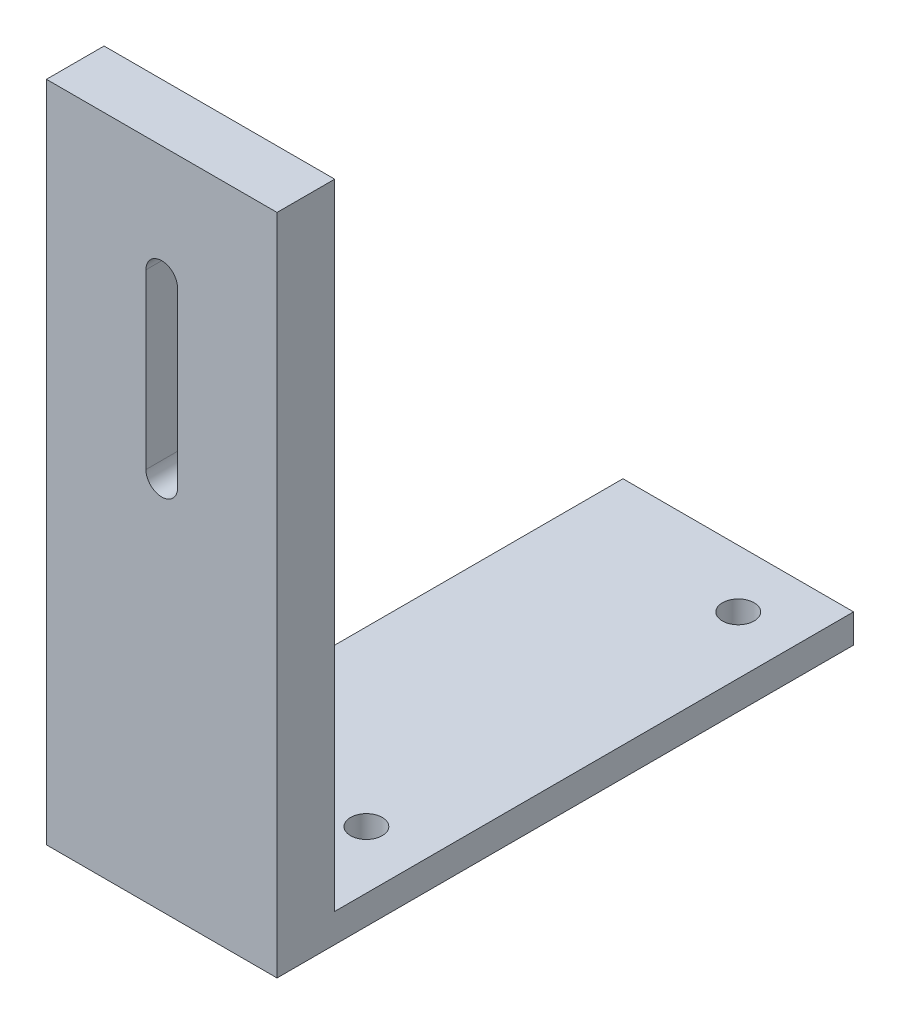
ISO-10303-21;
HEADER;
FILE_DESCRIPTION(('STEP AP214'),'2;1');
FILE_NAME('part.step','',(''),(''),'','','');
FILE_SCHEMA(('AUTOMOTIVE_DESIGN { 1 0 10303 214 1 1 1 1 }'));
ENDSEC;
DATA;
#1=APPLICATION_CONTEXT('core data for automotive mechanical design processes');
#2=APPLICATION_PROTOCOL_DEFINITION('international standard','automotive_design',2000,#1);
#3=PRODUCT_CONTEXT('',#1,'mechanical');
#4=PRODUCT('Part','Part','',(#3));
#5=PRODUCT_RELATED_PRODUCT_CATEGORY('part','',(#4));
#6=PRODUCT_DEFINITION_FORMATION('','',#4);
#7=PRODUCT_DEFINITION_CONTEXT('part definition',#1,'design');
#8=PRODUCT_DEFINITION('design','',#6,#7);
#9=PRODUCT_DEFINITION_SHAPE('','',#8);
#10=(LENGTH_UNIT() NAMED_UNIT(*) SI_UNIT(.MILLI.,.METRE.));
#11=(NAMED_UNIT(*) PLANE_ANGLE_UNIT() SI_UNIT($,.RADIAN.));
#12=(NAMED_UNIT(*) SI_UNIT($,.STERADIAN.) SOLID_ANGLE_UNIT());
#13=UNCERTAINTY_MEASURE_WITH_UNIT(LENGTH_MEASURE(1.E-05),#10,'distance_accuracy_value','');
#14=(GEOMETRIC_REPRESENTATION_CONTEXT(3) GLOBAL_UNCERTAINTY_ASSIGNED_CONTEXT((#13)) GLOBAL_UNIT_ASSIGNED_CONTEXT((#10,
#11,#12)) REPRESENTATION_CONTEXT('',''));
#15=CARTESIAN_POINT('',(0.,0.,0.));
#16=DIRECTION('',(0.,0.,1.));
#17=DIRECTION('',(1.,0.,0.));
#18=AXIS2_PLACEMENT_3D('',#15,#16,#17);
#19=CARTESIAN_POINT('',(-23.057052804601,5.,100.));
#20=DIRECTION('',(0.,-1.,0.));
#21=DIRECTION('',(0.,0.,-1.));
#22=AXIS2_PLACEMENT_3D('',#19,#20,#21);
#23=PLANE('',#22);
#24=CARTESIAN_POINT('',(6.94294719539896,5.,9.99999999999999));
#25=DIRECTION('',(0.,1.,0.));
#26=DIRECTION('',(0.,0.,1.));
#27=AXIS2_PLACEMENT_3D('',#24,#25,#26);
#28=CIRCLE('',#27,2.75);
#29=CARTESIAN_POINT('',(6.94294719539896,5.,12.75));
#30=VERTEX_POINT('',#29);
#31=EDGE_CURVE('E181',#30,#30,#28,.T.);
#32=ORIENTED_EDGE('',*,*,#31,.F.);
#33=EDGE_LOOP('',(#32));
#34=FACE_BOUND('',#33,.T.);
#35=CARTESIAN_POINT('',(6.94294719539897,5.,74.5));
#36=DIRECTION('',(0.,1.,0.));
#37=DIRECTION('',(0.,0.,1.));
#38=AXIS2_PLACEMENT_3D('',#35,#36,#37);
#39=CIRCLE('',#38,2.75);
#40=CARTESIAN_POINT('',(6.94294719539897,5.,77.25));
#41=VERTEX_POINT('',#40);
#42=EDGE_CURVE('E173',#41,#41,#39,.T.);
#43=ORIENTED_EDGE('',*,*,#42,.F.);
#44=EDGE_LOOP('',(#43));
#45=FACE_BOUND('',#44,.T.);
#46=DIRECTION('',(-1.,0.,0.));
#47=VECTOR('',#46,1.);
#48=CARTESIAN_POINT('',(-23.057052804601,5.,90.));
#49=LINE('',#48,#47);
#50=CARTESIAN_POINT('',(16.942947195399,5.,90.));
#51=VERTEX_POINT('',#50);
#52=CARTESIAN_POINT('',(-23.057052804601,5.,90.));
#53=VERTEX_POINT('',#52);
#54=EDGE_CURVE('E144',#51,#53,#49,.T.);
#55=ORIENTED_EDGE('',*,*,#54,.F.);
#56=DIRECTION('',(0.,0.,-1.));
#57=VECTOR('',#56,1.);
#58=CARTESIAN_POINT('',(16.942947195399,5.,100.));
#59=LINE('',#58,#57);
#60=CARTESIAN_POINT('',(16.942947195399,5.,0.));
#61=VERTEX_POINT('',#60);
#62=EDGE_CURVE('E11',#51,#61,#59,.T.);
#63=ORIENTED_EDGE('',*,*,#62,.T.);
#64=DIRECTION('',(-1.,0.,0.));
#65=VECTOR('',#64,1.);
#66=CARTESIAN_POINT('',(-23.057052804601,5.,0.));
#67=LINE('',#66,#65);
#68=CARTESIAN_POINT('',(-23.057052804601,5.,0.));
#69=VERTEX_POINT('',#68);
#70=EDGE_CURVE('E199',#61,#69,#67,.T.);
#71=ORIENTED_EDGE('',*,*,#70,.T.);
#72=DIRECTION('',(0.,0.,-1.));
#73=VECTOR('',#72,1.);
#74=CARTESIAN_POINT('',(-23.057052804601,5.,100.));
#75=LINE('',#74,#73);
#76=EDGE_CURVE('E42',#53,#69,#75,.T.);
#77=ORIENTED_EDGE('',*,*,#76,.F.);
#78=EDGE_LOOP('',(#55,#63,#71,#77));
#79=FACE_BOUND('',#78,.T.);
#80=ADVANCED_FACE('F33',(#34,#45,#79),#23,.F.);
#81=CARTESIAN_POINT('',(16.942947195399,5.,100.));
#82=DIRECTION('',(-1.,0.,0.));
#83=DIRECTION('',(0.,-1.,0.));
#84=AXIS2_PLACEMENT_3D('',#81,#82,#83);
#85=PLANE('',#84);
#86=DIRECTION('',(0.,1.,0.));
#87=VECTOR('',#86,1.);
#88=CARTESIAN_POINT('',(16.942947195399,5.,0.));
#89=LINE('',#88,#87);
#90=CARTESIAN_POINT('',(16.942947195399,0.,0.));
#91=VERTEX_POINT('',#90);
#92=EDGE_CURVE('E186',#91,#61,#89,.T.);
#93=ORIENTED_EDGE('',*,*,#92,.T.);
#94=ORIENTED_EDGE('',*,*,#62,.F.);
#95=DIRECTION('',(0.,-1.,0.));
#96=VECTOR('',#95,1.);
#97=CARTESIAN_POINT('',(16.942947195399,115.,90.));
#98=LINE('',#97,#96);
#99=CARTESIAN_POINT('',(16.942947195399,115.,90.));
#100=VERTEX_POINT('',#99);
#101=EDGE_CURVE('E170',#100,#51,#98,.T.);
#102=ORIENTED_EDGE('',*,*,#101,.F.);
#103=DIRECTION('',(0.,0.,-1.));
#104=VECTOR('',#103,1.);
#105=CARTESIAN_POINT('',(16.942947195399,115.,100.));
#106=LINE('',#105,#104);
#107=CARTESIAN_POINT('',(16.942947195399,115.,100.));
#108=VERTEX_POINT('',#107);
#109=EDGE_CURVE('E154',#108,#100,#106,.T.);
#110=ORIENTED_EDGE('',*,*,#109,.F.);
#111=DIRECTION('',(0.,1.,0.));
#112=VECTOR('',#111,1.);
#113=CARTESIAN_POINT('',(16.942947195399,5.,100.));
#114=LINE('',#113,#112);
#115=CARTESIAN_POINT('',(16.942947195399,0.,100.));
#116=VERTEX_POINT('',#115);
#117=EDGE_CURVE('E189',#116,#108,#114,.T.);
#118=ORIENTED_EDGE('',*,*,#117,.F.);
#119=DIRECTION('',(0.,0.,-1.));
#120=VECTOR('',#119,1.);
#121=CARTESIAN_POINT('',(16.942947195399,0.,100.));
#122=LINE('',#121,#120);
#123=EDGE_CURVE('E196',#116,#91,#122,.T.);
#124=ORIENTED_EDGE('',*,*,#123,.T.);
#125=EDGE_LOOP('',(#93,#94,#102,#110,#118,#124));
#126=FACE_BOUND('',#125,.T.);
#127=ADVANCED_FACE('F35',(#126),#85,.F.);
#128=CARTESIAN_POINT('',(-23.057052804601,5.,100.));
#129=DIRECTION('',(1.,0.,0.));
#130=DIRECTION('',(0.,0.,-1.));
#131=AXIS2_PLACEMENT_3D('',#128,#129,#130);
#132=PLANE('',#131);
#133=DIRECTION('',(0.,-1.,0.));
#134=VECTOR('',#133,1.);
#135=CARTESIAN_POINT('',(-23.057052804601,5.,0.));
#136=LINE('',#135,#134);
#137=CARTESIAN_POINT('',(-23.057052804601,0.,0.));
#138=VERTEX_POINT('',#137);
#139=EDGE_CURVE('E202',#69,#138,#136,.T.);
#140=ORIENTED_EDGE('',*,*,#139,.T.);
#141=DIRECTION('',(0.,0.,-1.));
#142=VECTOR('',#141,1.);
#143=CARTESIAN_POINT('',(-23.057052804601,0.,100.));
#144=LINE('',#143,#142);
#145=CARTESIAN_POINT('',(-23.057052804601,0.,100.));
#146=VERTEX_POINT('',#145);
#147=EDGE_CURVE('E207',#146,#138,#144,.T.);
#148=ORIENTED_EDGE('',*,*,#147,.F.);
#149=DIRECTION('',(0.,-1.,0.));
#150=VECTOR('',#149,1.);
#151=CARTESIAN_POINT('',(-23.057052804601,5.,100.));
#152=LINE('',#151,#150);
#153=CARTESIAN_POINT('',(-23.057052804601,115.,100.));
#154=VERTEX_POINT('',#153);
#155=EDGE_CURVE('E191',#154,#146,#152,.T.);
#156=ORIENTED_EDGE('',*,*,#155,.F.);
#157=DIRECTION('',(0.,0.,1.));
#158=VECTOR('',#157,1.);
#159=CARTESIAN_POINT('',(-23.057052804601,115.,100.));
#160=LINE('',#159,#158);
#161=CARTESIAN_POINT('',(-23.057052804601,115.,90.));
#162=VERTEX_POINT('',#161);
#163=EDGE_CURVE('E148',#162,#154,#160,.T.);
#164=ORIENTED_EDGE('',*,*,#163,.F.);
#165=DIRECTION('',(0.,-1.,0.));
#166=VECTOR('',#165,1.);
#167=CARTESIAN_POINT('',(-23.057052804601,115.,90.));
#168=LINE('',#167,#166);
#169=EDGE_CURVE('E158',#162,#53,#168,.T.);
#170=ORIENTED_EDGE('',*,*,#169,.T.);
#171=ORIENTED_EDGE('',*,*,#76,.T.);
#172=EDGE_LOOP('',(#140,#148,#156,#164,#170,#171));
#173=FACE_BOUND('',#172,.T.);
#174=ADVANCED_FACE('F213',(#173),#132,.F.);
#175=CARTESIAN_POINT('',(-23.057052804601,0.,100.));
#176=DIRECTION('',(0.,1.,0.));
#177=DIRECTION('',(-1.,0.,0.));
#178=AXIS2_PLACEMENT_3D('',#175,#176,#177);
#179=PLANE('',#178);
#180=CARTESIAN_POINT('',(6.94294719539897,0.,74.5));
#181=DIRECTION('',(0.,1.,0.));
#182=DIRECTION('',(0.,0.,1.));
#183=AXIS2_PLACEMENT_3D('',#180,#181,#182);
#184=CIRCLE('',#183,2.75);
#185=CARTESIAN_POINT('',(6.94294719539897,0.,77.25));
#186=VERTEX_POINT('',#185);
#187=EDGE_CURVE('E161',#186,#186,#184,.T.);
#188=ORIENTED_EDGE('',*,*,#187,.T.);
#189=EDGE_LOOP('',(#188));
#190=FACE_BOUND('',#189,.T.);
#191=CARTESIAN_POINT('',(6.94294719539896,0.,9.99999999999999));
#192=DIRECTION('',(0.,1.,0.));
#193=DIRECTION('',(0.,0.,1.));
#194=AXIS2_PLACEMENT_3D('',#191,#192,#193);
#195=CIRCLE('',#194,2.75);
#196=CARTESIAN_POINT('',(6.94294719539896,0.,12.75));
#197=VERTEX_POINT('',#196);
#198=EDGE_CURVE('E183',#197,#197,#195,.T.);
#199=ORIENTED_EDGE('',*,*,#198,.T.);
#200=EDGE_LOOP('',(#199));
#201=FACE_BOUND('',#200,.T.);
#202=DIRECTION('',(1.,0.,0.));
#203=VECTOR('',#202,1.);
#204=CARTESIAN_POINT('',(-23.057052804601,0.,0.));
#205=LINE('',#204,#203);
#206=EDGE_CURVE('E192',#138,#91,#205,.T.);
#207=ORIENTED_EDGE('',*,*,#206,.T.);
#208=ORIENTED_EDGE('',*,*,#123,.F.);
#209=DIRECTION('',(1.,0.,0.));
#210=VECTOR('',#209,1.);
#211=CARTESIAN_POINT('',(-23.057052804601,0.,100.));
#212=LINE('',#211,#210);
#213=EDGE_CURVE('E194',#146,#116,#212,.T.);
#214=ORIENTED_EDGE('',*,*,#213,.F.);
#215=ORIENTED_EDGE('',*,*,#147,.T.);
#216=EDGE_LOOP('',(#207,#208,#214,#215));
#217=FACE_BOUND('',#216,.T.);
#218=ADVANCED_FACE('F227',(#190,#201,#217),#179,.F.);
#219=CARTESIAN_POINT('',(0.,0.,100.));
#220=DIRECTION('',(0.,0.,1.));
#221=DIRECTION('',(1.,0.,0.));
#222=AXIS2_PLACEMENT_3D('',#219,#220,#221);
#223=PLANE('',#222);
#224=CARTESIAN_POINT('',(-3.05705280460104,95.,100.));
#225=DIRECTION('',(0.,0.,-1.));
#226=DIRECTION('',(-1.,0.,0.));
#227=AXIS2_PLACEMENT_3D('',#224,#225,#226);
#228=CIRCLE('',#227,2.75);
#229=CARTESIAN_POINT('',(-5.80705280460104,95.,100.));
#230=VERTEX_POINT('',#229);
#231=CARTESIAN_POINT('',(-0.307052804601035,95.,100.));
#232=VERTEX_POINT('',#231);
#233=EDGE_CURVE('E113',#230,#232,#228,.T.);
#234=ORIENTED_EDGE('',*,*,#233,.T.);
#235=DIRECTION('',(0.,-1.,0.));
#236=VECTOR('',#235,1.);
#237=CARTESIAN_POINT('',(-0.307052804601035,95.,100.));
#238=LINE('',#237,#236);
#239=CARTESIAN_POINT('',(-0.307052804601035,65.,100.));
#240=VERTEX_POINT('',#239);
#241=EDGE_CURVE('E122',#232,#240,#238,.T.);
#242=ORIENTED_EDGE('',*,*,#241,.T.);
#243=CARTESIAN_POINT('',(-3.05705280460104,65.,100.));
#244=DIRECTION('',(0.,0.,-1.));
#245=DIRECTION('',(-1.,0.,0.));
#246=AXIS2_PLACEMENT_3D('',#243,#244,#245);
#247=CIRCLE('',#246,2.75);
#248=CARTESIAN_POINT('',(-5.80705280460104,65.,100.));
#249=VERTEX_POINT('',#248);
#250=EDGE_CURVE('E50',#240,#249,#247,.T.);
#251=ORIENTED_EDGE('',*,*,#250,.T.);
#252=DIRECTION('',(0.,1.,0.));
#253=VECTOR('',#252,1.);
#254=CARTESIAN_POINT('',(-5.80705280460104,95.,100.));
#255=LINE('',#254,#253);
#256=EDGE_CURVE('E119',#249,#230,#255,.T.);
#257=ORIENTED_EDGE('',*,*,#256,.T.);
#258=EDGE_LOOP('',(#234,#242,#251,#257));
#259=FACE_BOUND('',#258,.T.);
#260=ORIENTED_EDGE('',*,*,#117,.T.);
#261=DIRECTION('',(1.,0.,0.));
#262=VECTOR('',#261,1.);
#263=CARTESIAN_POINT('',(-23.057052804601,115.,100.));
#264=LINE('',#263,#262);
#265=EDGE_CURVE('E151',#154,#108,#264,.T.);
#266=ORIENTED_EDGE('',*,*,#265,.F.);
#267=ORIENTED_EDGE('',*,*,#155,.T.);
#268=ORIENTED_EDGE('',*,*,#213,.T.);
#269=EDGE_LOOP('',(#260,#266,#267,#268));
#270=FACE_BOUND('',#269,.T.);
#271=ADVANCED_FACE('F126',(#259,#270),#223,.T.);
#272=CARTESIAN_POINT('',(0.,0.,0.));
#273=DIRECTION('',(0.,0.,1.));
#274=DIRECTION('',(1.,0.,0.));
#275=AXIS2_PLACEMENT_3D('',#272,#273,#274);
#276=PLANE('',#275);
#277=ORIENTED_EDGE('',*,*,#92,.F.);
#278=ORIENTED_EDGE('',*,*,#206,.F.);
#279=ORIENTED_EDGE('',*,*,#139,.F.);
#280=ORIENTED_EDGE('',*,*,#70,.F.);
#281=EDGE_LOOP('',(#277,#278,#279,#280));
#282=FACE_BOUND('',#281,.T.);
#283=ADVANCED_FACE('F224',(#282),#276,.F.);
#284=CARTESIAN_POINT('',(6.94294719539896,0.,9.99999999999999));
#285=DIRECTION('',(0.,1.,0.));
#286=DIRECTION('',(0.,0.,1.));
#287=AXIS2_PLACEMENT_3D('',#284,#285,#286);
#288=CYLINDRICAL_SURFACE('',#287,2.75);
#289=ORIENTED_EDGE('',*,*,#198,.F.);
#290=EDGE_LOOP('',(#289));
#291=FACE_BOUND('',#290,.T.);
#292=ORIENTED_EDGE('',*,*,#31,.T.);
#293=EDGE_LOOP('',(#292));
#294=FACE_BOUND('',#293,.T.);
#295=ADVANCED_FACE('F245',(#291,#294),#288,.F.);
#296=CARTESIAN_POINT('',(6.94294719539897,0.,74.5));
#297=DIRECTION('',(0.,1.,0.));
#298=DIRECTION('',(0.,0.,1.));
#299=AXIS2_PLACEMENT_3D('',#296,#297,#298);
#300=CYLINDRICAL_SURFACE('',#299,2.75);
#301=ORIENTED_EDGE('',*,*,#187,.F.);
#302=EDGE_LOOP('',(#301));
#303=FACE_BOUND('',#302,.T.);
#304=ORIENTED_EDGE('',*,*,#42,.T.);
#305=EDGE_LOOP('',(#304));
#306=FACE_BOUND('',#305,.T.);
#307=ADVANCED_FACE('F237',(#303,#306),#300,.F.);
#308=CARTESIAN_POINT('',(-23.057052804601,115.,90.));
#309=DIRECTION('',(0.,0.,1.));
#310=DIRECTION('',(1.,0.,0.));
#311=AXIS2_PLACEMENT_3D('',#308,#309,#310);
#312=PLANE('',#311);
#313=DIRECTION('',(0.,-1.,0.));
#314=VECTOR('',#313,1.);
#315=CARTESIAN_POINT('',(-0.307052804601035,95.,90.));
#316=LINE('',#315,#314);
#317=CARTESIAN_POINT('',(-0.307052804601034,95.,90.));
#318=VERTEX_POINT('',#317);
#319=CARTESIAN_POINT('',(-0.307052804601035,65.,90.));
#320=VERTEX_POINT('',#319);
#321=EDGE_CURVE('E138',#318,#320,#316,.T.);
#322=ORIENTED_EDGE('',*,*,#321,.F.);
#323=CARTESIAN_POINT('',(-3.05705280460104,95.,90.));
#324=DIRECTION('',(0.,0.,-1.));
#325=DIRECTION('',(-1.,0.,0.));
#326=AXIS2_PLACEMENT_3D('',#323,#324,#325);
#327=CIRCLE('',#326,2.75);
#328=CARTESIAN_POINT('',(-5.80705280460104,95.,90.));
#329=VERTEX_POINT('',#328);
#330=EDGE_CURVE('E58',#329,#318,#327,.T.);
#331=ORIENTED_EDGE('',*,*,#330,.F.);
#332=DIRECTION('',(0.,1.,0.));
#333=VECTOR('',#332,1.);
#334=CARTESIAN_POINT('',(-5.80705280460104,95.,90.));
#335=LINE('',#334,#333);
#336=CARTESIAN_POINT('',(-5.80705280460104,65.,90.));
#337=VERTEX_POINT('',#336);
#338=EDGE_CURVE('E129',#337,#329,#335,.T.);
#339=ORIENTED_EDGE('',*,*,#338,.F.);
#340=CARTESIAN_POINT('',(-3.05705280460104,65.,90.));
#341=DIRECTION('',(0.,0.,-1.));
#342=DIRECTION('',(-1.,0.,0.));
#343=AXIS2_PLACEMENT_3D('',#340,#341,#342);
#344=CIRCLE('',#343,2.75);
#345=EDGE_CURVE('E132',#320,#337,#344,.T.);
#346=ORIENTED_EDGE('',*,*,#345,.F.);
#347=EDGE_LOOP('',(#322,#331,#339,#346));
#348=FACE_BOUND('',#347,.T.);
#349=ORIENTED_EDGE('',*,*,#54,.T.);
#350=ORIENTED_EDGE('',*,*,#169,.F.);
#351=DIRECTION('',(-1.,0.,0.));
#352=VECTOR('',#351,1.);
#353=CARTESIAN_POINT('',(-23.057052804601,115.,90.));
#354=LINE('',#353,#352);
#355=EDGE_CURVE('E156',#100,#162,#354,.T.);
#356=ORIENTED_EDGE('',*,*,#355,.F.);
#357=ORIENTED_EDGE('',*,*,#101,.T.);
#358=EDGE_LOOP('',(#349,#350,#356,#357));
#359=FACE_BOUND('',#358,.T.);
#360=ADVANCED_FACE('F235',(#348,#359),#312,.F.);
#361=CARTESIAN_POINT('',(0.,115.,0.));
#362=DIRECTION('',(0.,-1.,0.));
#363=DIRECTION('',(0.,0.,-1.));
#364=AXIS2_PLACEMENT_3D('',#361,#362,#363);
#365=PLANE('',#364);
#366=ORIENTED_EDGE('',*,*,#163,.T.);
#367=ORIENTED_EDGE('',*,*,#265,.T.);
#368=ORIENTED_EDGE('',*,*,#109,.T.);
#369=ORIENTED_EDGE('',*,*,#355,.T.);
#370=EDGE_LOOP('',(#366,#367,#368,#369));
#371=FACE_BOUND('',#370,.T.);
#372=ADVANCED_FACE('F234',(#371),#365,.F.);
#373=CARTESIAN_POINT('',(-3.05705280460104,95.,100.));
#374=DIRECTION('',(0.,0.,-1.));
#375=DIRECTION('',(-1.,0.,0.));
#376=AXIS2_PLACEMENT_3D('',#373,#374,#375);
#377=CYLINDRICAL_SURFACE('',#376,2.75);
#378=ORIENTED_EDGE('',*,*,#330,.T.);
#379=DIRECTION('',(0.,0.,-1.));
#380=VECTOR('',#379,1.);
#381=CARTESIAN_POINT('',(-0.307052804601035,95.,100.));
#382=LINE('',#381,#380);
#383=EDGE_CURVE('E109',#232,#318,#382,.T.);
#384=ORIENTED_EDGE('',*,*,#383,.F.);
#385=ORIENTED_EDGE('',*,*,#233,.F.);
#386=DIRECTION('',(0.,0.,-1.));
#387=VECTOR('',#386,1.);
#388=CARTESIAN_POINT('',(-5.80705280460104,95.,100.));
#389=LINE('',#388,#387);
#390=EDGE_CURVE('E142',#230,#329,#389,.T.);
#391=ORIENTED_EDGE('',*,*,#390,.T.);
#392=EDGE_LOOP('',(#378,#384,#385,#391));
#393=FACE_BOUND('',#392,.T.);
#394=ADVANCED_FACE('F111',(#393),#377,.F.);
#395=CARTESIAN_POINT('',(-5.80705280460104,95.,100.));
#396=DIRECTION('',(-1.,0.,0.));
#397=DIRECTION('',(0.,0.,1.));
#398=AXIS2_PLACEMENT_3D('',#395,#396,#397);
#399=PLANE('',#398);
#400=ORIENTED_EDGE('',*,*,#338,.T.);
#401=ORIENTED_EDGE('',*,*,#390,.F.);
#402=ORIENTED_EDGE('',*,*,#256,.F.);
#403=DIRECTION('',(0.,0.,-1.));
#404=VECTOR('',#403,1.);
#405=CARTESIAN_POINT('',(-5.80705280460104,65.,100.));
#406=LINE('',#405,#404);
#407=EDGE_CURVE('E145',#249,#337,#406,.T.);
#408=ORIENTED_EDGE('',*,*,#407,.T.);
#409=EDGE_LOOP('',(#400,#401,#402,#408));
#410=FACE_BOUND('',#409,.T.);
#411=ADVANCED_FACE('F323',(#410),#399,.F.);
#412=CARTESIAN_POINT('',(-3.05705280460104,65.,100.));
#413=DIRECTION('',(0.,0.,-1.));
#414=DIRECTION('',(-1.,0.,0.));
#415=AXIS2_PLACEMENT_3D('',#412,#413,#414);
#416=CYLINDRICAL_SURFACE('',#415,2.75);
#417=ORIENTED_EDGE('',*,*,#345,.T.);
#418=ORIENTED_EDGE('',*,*,#407,.F.);
#419=ORIENTED_EDGE('',*,*,#250,.F.);
#420=DIRECTION('',(0.,0.,-1.));
#421=VECTOR('',#420,1.);
#422=CARTESIAN_POINT('',(-0.307052804601035,65.,100.));
#423=LINE('',#422,#421);
#424=EDGE_CURVE('E118',#240,#320,#423,.T.);
#425=ORIENTED_EDGE('',*,*,#424,.T.);
#426=EDGE_LOOP('',(#417,#418,#419,#425));
#427=FACE_BOUND('',#426,.T.);
#428=ADVANCED_FACE('F332',(#427),#416,.F.);
#429=CARTESIAN_POINT('',(-0.307052804601035,95.,100.));
#430=DIRECTION('',(1.,0.,0.));
#431=DIRECTION('',(0.,0.,-1.));
#432=AXIS2_PLACEMENT_3D('',#429,#430,#431);
#433=PLANE('',#432);
#434=ORIENTED_EDGE('',*,*,#321,.T.);
#435=ORIENTED_EDGE('',*,*,#424,.F.);
#436=ORIENTED_EDGE('',*,*,#241,.F.);
#437=ORIENTED_EDGE('',*,*,#383,.T.);
#438=EDGE_LOOP('',(#434,#435,#436,#437));
#439=FACE_BOUND('',#438,.T.);
#440=ADVANCED_FACE('F123',(#439),#433,.F.);
#441=CLOSED_SHELL('',(#80,#127,#174,#218,#271,#283,#295,#307,#360,#372,#394,#411,#428,#440));
#442=MANIFOLD_SOLID_BREP('B2',#441);
#443=ADVANCED_BREP_SHAPE_REPRESENTATION('',(#18,#442),#14);
#444=SHAPE_DEFINITION_REPRESENTATION(#9,#443);
ENDSEC;
END-ISO-10303-21;
